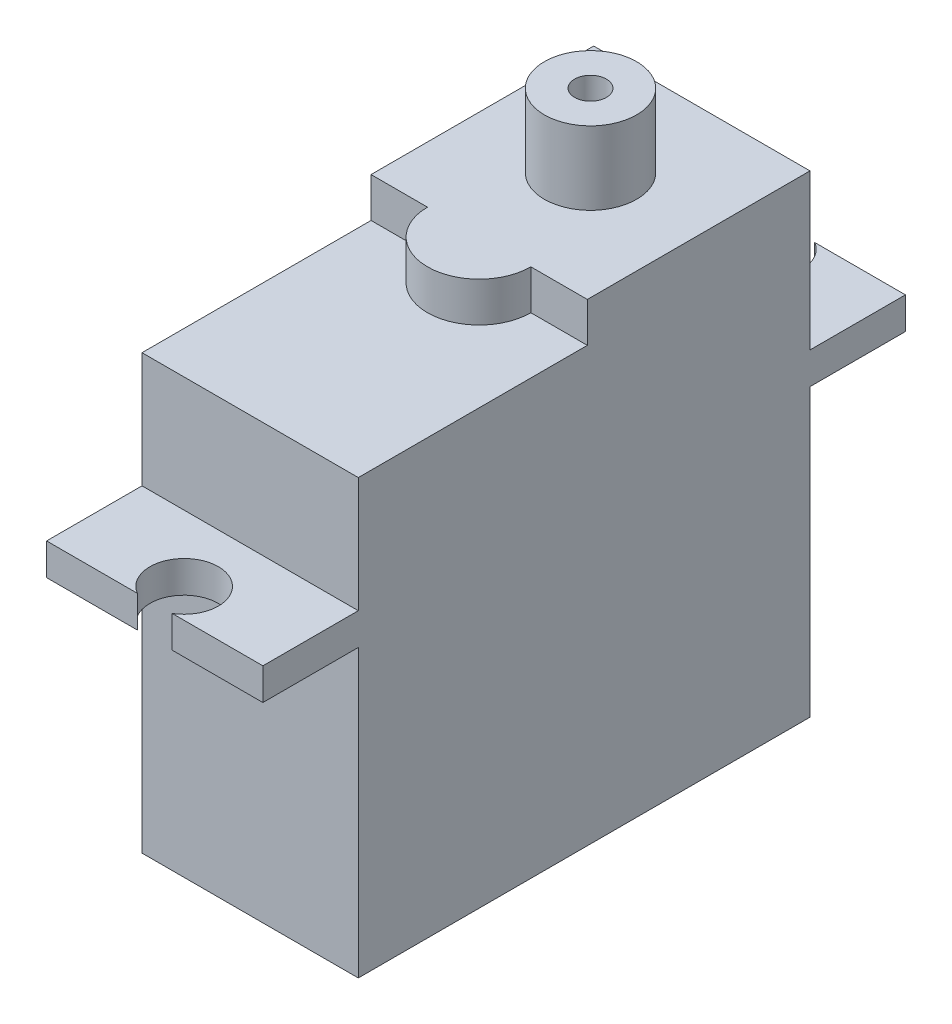
ISO-10303-21;
HEADER;
FILE_DESCRIPTION(('STEP AP214'),'2;1');
FILE_NAME('part.step','',(''),(''),'','','');
FILE_SCHEMA(('AUTOMOTIVE_DESIGN { 1 0 10303 214 1 1 1 1 }'));
ENDSEC;
DATA;
#1=APPLICATION_CONTEXT('core data for automotive mechanical design processes');
#2=APPLICATION_PROTOCOL_DEFINITION('international standard','automotive_design',2000,#1);
#3=PRODUCT_CONTEXT('',#1,'mechanical');
#4=PRODUCT('Part','Part','',(#3));
#5=PRODUCT_RELATED_PRODUCT_CATEGORY('part','',(#4));
#6=PRODUCT_DEFINITION_FORMATION('','',#4);
#7=PRODUCT_DEFINITION_CONTEXT('part definition',#1,'design');
#8=PRODUCT_DEFINITION('design','',#6,#7);
#9=PRODUCT_DEFINITION_SHAPE('','',#8);
#10=(LENGTH_UNIT() NAMED_UNIT(*) SI_UNIT(.MILLI.,.METRE.));
#11=(NAMED_UNIT(*) PLANE_ANGLE_UNIT() SI_UNIT($,.RADIAN.));
#12=(NAMED_UNIT(*) SI_UNIT($,.STERADIAN.) SOLID_ANGLE_UNIT());
#13=UNCERTAINTY_MEASURE_WITH_UNIT(LENGTH_MEASURE(1.E-05),#10,'distance_accuracy_value','');
#14=(GEOMETRIC_REPRESENTATION_CONTEXT(3) GLOBAL_UNCERTAINTY_ASSIGNED_CONTEXT((#13)) GLOBAL_UNIT_ASSIGNED_CONTEXT((#10,
#11,#12)) REPRESENTATION_CONTEXT('',''));
#15=CARTESIAN_POINT('',(0.,0.,0.));
#16=DIRECTION('',(0.,0.,1.));
#17=DIRECTION('',(1.,0.,0.));
#18=AXIS2_PLACEMENT_3D('',#15,#16,#17);
#19=CARTESIAN_POINT('',(-6.79999999999999,18.,-20.2));
#20=DIRECTION('',(0.,0.,1.));
#21=DIRECTION('',(1.,0.,0.));
#22=AXIS2_PLACEMENT_3D('',#19,#20,#21);
#23=PLANE('',#22);
#24=DIRECTION('',(1.,0.,0.));
#25=VECTOR('',#24,1.);
#26=CARTESIAN_POINT('',(-6.79999999999999,18.,-20.2));
#27=LINE('',#26,#25);
#28=CARTESIAN_POINT('',(1.09544511501033,18.,-20.2));
#29=VERTEX_POINT('',#28);
#30=CARTESIAN_POINT('',(6.79999999999999,18.,-20.2));
#31=VERTEX_POINT('',#30);
#32=EDGE_CURVE('E176',#29,#31,#27,.T.);
#33=ORIENTED_EDGE('',*,*,#32,.F.);
#34=DIRECTION('',(0.,1.,0.));
#35=VECTOR('',#34,1.);
#36=CARTESIAN_POINT('',(1.09544511501033,11.9188816817957,-20.2));
#37=LINE('',#36,#35);
#38=CARTESIAN_POINT('',(1.09544511501033,20.,-20.2));
#39=VERTEX_POINT('',#38);
#40=EDGE_CURVE('E11',#29,#39,#37,.T.);
#41=ORIENTED_EDGE('',*,*,#40,.T.);
#42=DIRECTION('',(1.,0.,0.));
#43=VECTOR('',#42,1.);
#44=CARTESIAN_POINT('',(-6.79999999999999,20.,-20.2));
#45=LINE('',#44,#43);
#46=CARTESIAN_POINT('',(6.79999999999999,20.,-20.2));
#47=VERTEX_POINT('',#46);
#48=EDGE_CURVE('E203',#39,#47,#45,.T.);
#49=ORIENTED_EDGE('',*,*,#48,.T.);
#50=DIRECTION('',(0.,1.,0.));
#51=VECTOR('',#50,1.);
#52=CARTESIAN_POINT('',(6.79999999999999,18.,-20.2));
#53=LINE('',#52,#51);
#54=EDGE_CURVE('E183',#31,#47,#53,.T.);
#55=ORIENTED_EDGE('',*,*,#54,.F.);
#56=EDGE_LOOP('',(#33,#41,#49,#55));
#57=FACE_BOUND('',#56,.T.);
#58=ADVANCED_FACE('F33',(#57),#23,.F.);
#59=CARTESIAN_POINT('',(-6.79999999999999,18.,20.2));
#60=DIRECTION('',(0.,0.,-1.));
#61=DIRECTION('',(-1.,0.,0.));
#62=AXIS2_PLACEMENT_3D('',#59,#60,#61);
#63=PLANE('',#62);
#64=DIRECTION('',(-1.,0.,0.));
#65=VECTOR('',#64,1.);
#66=CARTESIAN_POINT('',(-6.79999999999999,18.,20.2));
#67=LINE('',#66,#65);
#68=CARTESIAN_POINT('',(-1.09544511501033,18.,20.2));
#69=VERTEX_POINT('',#68);
#70=CARTESIAN_POINT('',(-6.79999999999999,18.,20.2));
#71=VERTEX_POINT('',#70);
#72=EDGE_CURVE('E354',#69,#71,#67,.T.);
#73=ORIENTED_EDGE('',*,*,#72,.F.);
#74=DIRECTION('',(0.,1.,0.));
#75=VECTOR('',#74,1.);
#76=CARTESIAN_POINT('',(-1.09544511501033,11.9188816817957,20.2));
#77=LINE('',#76,#75);
#78=CARTESIAN_POINT('',(-1.09544511501033,20.,20.2));
#79=VERTEX_POINT('',#78);
#80=EDGE_CURVE('E358',#69,#79,#77,.T.);
#81=ORIENTED_EDGE('',*,*,#80,.T.);
#82=DIRECTION('',(-1.,0.,0.));
#83=VECTOR('',#82,1.);
#84=CARTESIAN_POINT('',(-6.79999999999999,20.,20.2));
#85=LINE('',#84,#83);
#86=CARTESIAN_POINT('',(-6.79999999999999,20.,20.2));
#87=VERTEX_POINT('',#86);
#88=EDGE_CURVE('E194',#79,#87,#85,.T.);
#89=ORIENTED_EDGE('',*,*,#88,.T.);
#90=DIRECTION('',(0.,1.,0.));
#91=VECTOR('',#90,1.);
#92=CARTESIAN_POINT('',(-6.79999999999999,18.,20.2));
#93=LINE('',#92,#91);
#94=EDGE_CURVE('E212',#71,#87,#93,.T.);
#95=ORIENTED_EDGE('',*,*,#94,.F.);
#96=EDGE_LOOP('',(#73,#81,#89,#95));
#97=FACE_BOUND('',#96,.T.);
#98=ADVANCED_FACE('F388',(#97),#63,.F.);
#99=CARTESIAN_POINT('',(-6.79999999999999,27.25,-14.2));
#100=DIRECTION('',(0.,0.,1.));
#101=DIRECTION('',(1.,0.,0.));
#102=AXIS2_PLACEMENT_3D('',#99,#100,#101);
#103=PLANE('',#102);
#104=DIRECTION('',(-1.,0.,0.));
#105=VECTOR('',#104,1.);
#106=CARTESIAN_POINT('',(-6.79999999999999,18.,-14.2));
#107=LINE('',#106,#105);
#108=CARTESIAN_POINT('',(6.79999999999999,18.,-14.2));
#109=VERTEX_POINT('',#108);
#110=CARTESIAN_POINT('',(-6.79999999999999,18.,-14.2));
#111=VERTEX_POINT('',#110);
#112=EDGE_CURVE('E221',#109,#111,#107,.T.);
#113=ORIENTED_EDGE('',*,*,#112,.F.);
#114=DIRECTION('',(0.,-1.,0.));
#115=VECTOR('',#114,1.);
#116=CARTESIAN_POINT('',(6.80000000000001,27.25,-14.2));
#117=LINE('',#116,#115);
#118=CARTESIAN_POINT('',(6.80000000000001,0.,-14.2));
#119=VERTEX_POINT('',#118);
#120=EDGE_CURVE('E295',#109,#119,#117,.T.);
#121=ORIENTED_EDGE('',*,*,#120,.T.);
#122=DIRECTION('',(-1.,0.,0.));
#123=VECTOR('',#122,1.);
#124=CARTESIAN_POINT('',(-6.79999999999999,0.,-14.2));
#125=LINE('',#124,#123);
#126=CARTESIAN_POINT('',(-6.79999999999999,0.,-14.2));
#127=VERTEX_POINT('',#126);
#128=EDGE_CURVE('E313',#119,#127,#125,.T.);
#129=ORIENTED_EDGE('',*,*,#128,.T.);
#130=DIRECTION('',(0.,-1.,0.));
#131=VECTOR('',#130,1.);
#132=CARTESIAN_POINT('',(-6.79999999999999,27.25,-14.2));
#133=LINE('',#132,#131);
#134=EDGE_CURVE('E299',#111,#127,#133,.T.);
#135=ORIENTED_EDGE('',*,*,#134,.F.);
#136=EDGE_LOOP('',(#113,#121,#129,#135));
#137=FACE_BOUND('',#136,.T.);
#138=ADVANCED_FACE('F401',(#137),#103,.F.);
#139=CARTESIAN_POINT('',(-6.79999999999999,27.25,14.2));
#140=DIRECTION('',(0.,0.,-1.));
#141=DIRECTION('',(-1.,0.,0.));
#142=AXIS2_PLACEMENT_3D('',#139,#140,#141);
#143=PLANE('',#142);
#144=DIRECTION('',(1.,0.,0.));
#145=VECTOR('',#144,1.);
#146=CARTESIAN_POINT('',(-6.79999999999999,18.,14.2));
#147=LINE('',#146,#145);
#148=CARTESIAN_POINT('',(-6.79999999999999,18.,14.2));
#149=VERTEX_POINT('',#148);
#150=CARTESIAN_POINT('',(6.79999999999999,18.,14.2));
#151=VERTEX_POINT('',#150);
#152=EDGE_CURVE('E369',#149,#151,#147,.T.);
#153=ORIENTED_EDGE('',*,*,#152,.F.);
#154=DIRECTION('',(0.,-1.,0.));
#155=VECTOR('',#154,1.);
#156=CARTESIAN_POINT('',(-6.79999999999999,27.25,14.2));
#157=LINE('',#156,#155);
#158=CARTESIAN_POINT('',(-6.79999999999999,0.,14.2));
#159=VERTEX_POINT('',#158);
#160=EDGE_CURVE('E303',#149,#159,#157,.T.);
#161=ORIENTED_EDGE('',*,*,#160,.T.);
#162=DIRECTION('',(1.,0.,0.));
#163=VECTOR('',#162,1.);
#164=CARTESIAN_POINT('',(-6.79999999999999,0.,14.2));
#165=LINE('',#164,#163);
#166=CARTESIAN_POINT('',(6.80000000000001,0.,14.2));
#167=VERTEX_POINT('',#166);
#168=EDGE_CURVE('E290',#159,#167,#165,.T.);
#169=ORIENTED_EDGE('',*,*,#168,.T.);
#170=DIRECTION('',(0.,-1.,0.));
#171=VECTOR('',#170,1.);
#172=CARTESIAN_POINT('',(6.80000000000001,27.25,14.2));
#173=LINE('',#172,#171);
#174=EDGE_CURVE('E307',#151,#167,#173,.T.);
#175=ORIENTED_EDGE('',*,*,#174,.F.);
#176=EDGE_LOOP('',(#153,#161,#169,#175));
#177=FACE_BOUND('',#176,.T.);
#178=ADVANCED_FACE('F395',(#177),#143,.F.);
#179=CARTESIAN_POINT('',(0.,29.75,0.));
#180=DIRECTION('',(0.,1.,0.));
#181=DIRECTION('',(0.,0.,1.));
#182=AXIS2_PLACEMENT_3D('',#179,#180,#181);
#183=PLANE('',#182);
#184=DIRECTION('',(-1.,0.,0.));
#185=VECTOR('',#184,1.);
#186=CARTESIAN_POINT('',(0.,29.75,-0.2));
#187=LINE('',#186,#185);
#188=CARTESIAN_POINT('',(-3.24999999999999,29.75,-0.199999999999999));
#189=VERTEX_POINT('',#188);
#190=CARTESIAN_POINT('',(-6.79999999999999,29.75,-0.2));
#191=VERTEX_POINT('',#190);
#192=EDGE_CURVE('E233',#189,#191,#187,.T.);
#193=ORIENTED_EDGE('',*,*,#192,.F.);
#194=CARTESIAN_POINT('',(0.,29.75,-0.2));
#195=DIRECTION('',(0.,1.,0.));
#196=DIRECTION('',(0.,0.,1.));
#197=AXIS2_PLACEMENT_3D('',#194,#195,#196);
#198=CIRCLE('',#197,3.25);
#199=CARTESIAN_POINT('',(3.25000000000001,29.75,-0.2));
#200=VERTEX_POINT('',#199);
#201=EDGE_CURVE('E236',#189,#200,#198,.T.);
#202=ORIENTED_EDGE('',*,*,#201,.T.);
#203=CARTESIAN_POINT('',(6.80000000000001,29.75,-0.200000000000001));
#204=VERTEX_POINT('',#203);
#205=EDGE_CURVE('E238',#204,#200,#187,.T.);
#206=ORIENTED_EDGE('',*,*,#205,.F.);
#207=DIRECTION('',(0.,0.,-1.));
#208=VECTOR('',#207,1.);
#209=CARTESIAN_POINT('',(6.80000000000001,29.75,0.));
#210=LINE('',#209,#208);
#211=CARTESIAN_POINT('',(6.80000000000001,29.75,-14.2));
#212=VERTEX_POINT('',#211);
#213=EDGE_CURVE('E240',#204,#212,#210,.T.);
#214=ORIENTED_EDGE('',*,*,#213,.T.);
#215=DIRECTION('',(-1.,0.,0.));
#216=VECTOR('',#215,1.);
#217=CARTESIAN_POINT('',(0.,29.75,-14.2));
#218=LINE('',#217,#216);
#219=CARTESIAN_POINT('',(-6.79999999999999,29.75,-14.2));
#220=VERTEX_POINT('',#219);
#221=EDGE_CURVE('E243',#212,#220,#218,.T.);
#222=ORIENTED_EDGE('',*,*,#221,.T.);
#223=DIRECTION('',(0.,0.,1.));
#224=VECTOR('',#223,1.);
#225=CARTESIAN_POINT('',(-6.79999999999999,29.75,0.));
#226=LINE('',#225,#224);
#227=EDGE_CURVE('E246',#220,#191,#226,.T.);
#228=ORIENTED_EDGE('',*,*,#227,.T.);
#229=EDGE_LOOP('',(#193,#202,#206,#214,#222,#228));
#230=FACE_BOUND('',#229,.T.);
#231=CARTESIAN_POINT('',(0.,29.75,-7.2));
#232=DIRECTION('',(0.,1.,0.));
#233=DIRECTION('',(0.,0.,1.));
#234=AXIS2_PLACEMENT_3D('',#231,#232,#233);
#235=CIRCLE('',#234,2.9);
#236=CARTESIAN_POINT('',(0.,29.75,-4.3));
#237=VERTEX_POINT('',#236);
#238=EDGE_CURVE('E226',#237,#237,#235,.T.);
#239=ORIENTED_EDGE('',*,*,#238,.F.);
#240=EDGE_LOOP('',(#239));
#241=FACE_BOUND('',#240,.T.);
#242=ADVANCED_FACE('F341',(#230,#241),#183,.T.);
#243=CARTESIAN_POINT('',(6.80000000000001,27.25,14.2));
#244=DIRECTION('',(-1.,0.,0.));
#245=DIRECTION('',(0.,0.,1.));
#246=AXIS2_PLACEMENT_3D('',#243,#244,#245);
#247=PLANE('',#246);
#248=CARTESIAN_POINT('',(6.80000000000001,27.25,14.2));
#249=VERTEX_POINT('',#248);
#250=CARTESIAN_POINT('',(6.80000000000001,20.,14.2));
#251=VERTEX_POINT('',#250);
#252=EDGE_CURVE('E304',#249,#251,#173,.T.);
#253=ORIENTED_EDGE('',*,*,#252,.T.);
#254=DIRECTION('',(0.,0.,1.));
#255=VECTOR('',#254,1.);
#256=CARTESIAN_POINT('',(6.79999999999999,20.,-20.2));
#257=LINE('',#256,#255);
#258=CARTESIAN_POINT('',(6.79999999999999,20.,20.2));
#259=VERTEX_POINT('',#258);
#260=EDGE_CURVE('E195',#251,#259,#257,.T.);
#261=ORIENTED_EDGE('',*,*,#260,.T.);
#262=DIRECTION('',(0.,1.,0.));
#263=VECTOR('',#262,1.);
#264=CARTESIAN_POINT('',(6.79999999999999,18.,20.2));
#265=LINE('',#264,#263);
#266=CARTESIAN_POINT('',(6.79999999999999,18.,20.2));
#267=VERTEX_POINT('',#266);
#268=EDGE_CURVE('E215',#267,#259,#265,.T.);
#269=ORIENTED_EDGE('',*,*,#268,.F.);
#270=DIRECTION('',(0.,0.,1.));
#271=VECTOR('',#270,1.);
#272=CARTESIAN_POINT('',(6.79999999999999,18.,-20.2));
#273=LINE('',#272,#271);
#274=EDGE_CURVE('E207',#151,#267,#273,.T.);
#275=ORIENTED_EDGE('',*,*,#274,.F.);
#276=ORIENTED_EDGE('',*,*,#174,.T.);
#277=DIRECTION('',(0.,0.,-1.));
#278=VECTOR('',#277,1.);
#279=CARTESIAN_POINT('',(6.80000000000001,0.,14.2));
#280=LINE('',#279,#278);
#281=EDGE_CURVE('E282',#167,#119,#280,.T.);
#282=ORIENTED_EDGE('',*,*,#281,.T.);
#283=ORIENTED_EDGE('',*,*,#120,.F.);
#284=EDGE_CURVE('E352',#31,#109,#273,.T.);
#285=ORIENTED_EDGE('',*,*,#284,.F.);
#286=ORIENTED_EDGE('',*,*,#54,.T.);
#287=CARTESIAN_POINT('',(6.79999999999999,20.,-14.2));
#288=VERTEX_POINT('',#287);
#289=EDGE_CURVE('E191',#47,#288,#257,.T.);
#290=ORIENTED_EDGE('',*,*,#289,.T.);
#291=EDGE_CURVE('E291',#212,#288,#117,.T.);
#292=ORIENTED_EDGE('',*,*,#291,.F.);
#293=ORIENTED_EDGE('',*,*,#213,.F.);
#294=DIRECTION('',(0.,-1.,0.));
#295=VECTOR('',#294,1.);
#296=CARTESIAN_POINT('',(6.80000000000001,29.75,-0.200000000000001));
#297=LINE('',#296,#295);
#298=CARTESIAN_POINT('',(6.80000000000001,27.25,-0.199999999999994));
#299=VERTEX_POINT('',#298);
#300=EDGE_CURVE('E265',#204,#299,#297,.T.);
#301=ORIENTED_EDGE('',*,*,#300,.T.);
#302=DIRECTION('',(0.,0.,-1.));
#303=VECTOR('',#302,1.);
#304=CARTESIAN_POINT('',(6.80000000000001,27.25,14.2));
#305=LINE('',#304,#303);
#306=EDGE_CURVE('E288',#249,#299,#305,.T.);
#307=ORIENTED_EDGE('',*,*,#306,.F.);
#308=EDGE_LOOP('',(#253,#261,#269,#275,#276,#282,#283,#285,#286,#290,#292,#293,#301,#307));
#309=FACE_BOUND('',#308,.T.);
#310=ADVANCED_FACE('F35',(#309),#247,.F.);
#311=ORIENTED_EDGE('',*,*,#291,.T.);
#312=DIRECTION('',(-1.,0.,0.));
#313=VECTOR('',#312,1.);
#314=CARTESIAN_POINT('',(-6.79999999999999,20.,-14.2));
#315=LINE('',#314,#313);
#316=CARTESIAN_POINT('',(-6.79999999999999,20.,-14.2));
#317=VERTEX_POINT('',#316);
#318=EDGE_CURVE('E218',#288,#317,#315,.T.);
#319=ORIENTED_EDGE('',*,*,#318,.T.);
#320=EDGE_CURVE('E296',#220,#317,#133,.T.);
#321=ORIENTED_EDGE('',*,*,#320,.F.);
#322=ORIENTED_EDGE('',*,*,#221,.F.);
#323=EDGE_LOOP('',(#311,#319,#321,#322));
#324=FACE_BOUND('',#323,.T.);
#325=ADVANCED_FACE('F346',(#324),#103,.F.);
#326=CARTESIAN_POINT('',(-6.79999999999999,27.25,14.2));
#327=DIRECTION('',(1.,0.,0.));
#328=DIRECTION('',(0.,0.,-1.));
#329=AXIS2_PLACEMENT_3D('',#326,#327,#328);
#330=PLANE('',#329);
#331=ORIENTED_EDGE('',*,*,#320,.T.);
#332=DIRECTION('',(0.,0.,-1.));
#333=VECTOR('',#332,1.);
#334=CARTESIAN_POINT('',(-6.79999999999999,20.,-20.2));
#335=LINE('',#334,#333);
#336=CARTESIAN_POINT('',(-6.79999999999999,20.,-20.2));
#337=VERTEX_POINT('',#336);
#338=EDGE_CURVE('E199',#317,#337,#335,.T.);
#339=ORIENTED_EDGE('',*,*,#338,.T.);
#340=DIRECTION('',(0.,1.,0.));
#341=VECTOR('',#340,1.);
#342=CARTESIAN_POINT('',(-6.79999999999999,18.,-20.2));
#343=LINE('',#342,#341);
#344=CARTESIAN_POINT('',(-6.79999999999999,18.,-20.2));
#345=VERTEX_POINT('',#344);
#346=EDGE_CURVE('E209',#345,#337,#343,.T.);
#347=ORIENTED_EDGE('',*,*,#346,.F.);
#348=DIRECTION('',(0.,0.,-1.));
#349=VECTOR('',#348,1.);
#350=CARTESIAN_POINT('',(-6.79999999999999,18.,-20.2));
#351=LINE('',#350,#349);
#352=EDGE_CURVE('E187',#111,#345,#351,.T.);
#353=ORIENTED_EDGE('',*,*,#352,.F.);
#354=ORIENTED_EDGE('',*,*,#134,.T.);
#355=DIRECTION('',(0.,0.,1.));
#356=VECTOR('',#355,1.);
#357=CARTESIAN_POINT('',(-6.79999999999999,0.,14.2));
#358=LINE('',#357,#356);
#359=EDGE_CURVE('E310',#127,#159,#358,.T.);
#360=ORIENTED_EDGE('',*,*,#359,.T.);
#361=ORIENTED_EDGE('',*,*,#160,.F.);
#362=EDGE_CURVE('E185',#71,#149,#351,.T.);
#363=ORIENTED_EDGE('',*,*,#362,.F.);
#364=ORIENTED_EDGE('',*,*,#94,.T.);
#365=CARTESIAN_POINT('',(-6.79999999999999,20.,14.2));
#366=VERTEX_POINT('',#365);
#367=EDGE_CURVE('E200',#87,#366,#335,.T.);
#368=ORIENTED_EDGE('',*,*,#367,.T.);
#369=CARTESIAN_POINT('',(-6.79999999999999,27.25,14.2));
#370=VERTEX_POINT('',#369);
#371=EDGE_CURVE('E300',#370,#366,#157,.T.);
#372=ORIENTED_EDGE('',*,*,#371,.F.);
#373=DIRECTION('',(0.,0.,1.));
#374=VECTOR('',#373,1.);
#375=CARTESIAN_POINT('',(-6.79999999999999,27.25,14.2));
#376=LINE('',#375,#374);
#377=CARTESIAN_POINT('',(-6.79999999999999,27.25,-0.199999999999992));
#378=VERTEX_POINT('',#377);
#379=EDGE_CURVE('E260',#378,#370,#376,.T.);
#380=ORIENTED_EDGE('',*,*,#379,.F.);
#381=DIRECTION('',(0.,-1.,0.));
#382=VECTOR('',#381,1.);
#383=CARTESIAN_POINT('',(-6.79999999999999,29.75,-0.2));
#384=LINE('',#383,#382);
#385=EDGE_CURVE('E248',#191,#378,#384,.T.);
#386=ORIENTED_EDGE('',*,*,#385,.F.);
#387=ORIENTED_EDGE('',*,*,#227,.F.);
#388=EDGE_LOOP('',(#331,#339,#347,#353,#354,#360,#361,#363,#364,#368,#372,#380,#386,#387));
#389=FACE_BOUND('',#388,.T.);
#390=ADVANCED_FACE('F327',(#389),#330,.F.);
#391=ORIENTED_EDGE('',*,*,#371,.T.);
#392=DIRECTION('',(1.,0.,0.));
#393=VECTOR('',#392,1.);
#394=CARTESIAN_POINT('',(-6.79999999999999,20.,14.2));
#395=LINE('',#394,#393);
#396=EDGE_CURVE('E332',#366,#251,#395,.T.);
#397=ORIENTED_EDGE('',*,*,#396,.T.);
#398=ORIENTED_EDGE('',*,*,#252,.F.);
#399=DIRECTION('',(1.,0.,0.));
#400=VECTOR('',#399,1.);
#401=CARTESIAN_POINT('',(-6.79999999999999,27.25,14.2));
#402=LINE('',#401,#400);
#403=EDGE_CURVE('E317',#370,#249,#402,.T.);
#404=ORIENTED_EDGE('',*,*,#403,.F.);
#405=EDGE_LOOP('',(#391,#397,#398,#404));
#406=FACE_BOUND('',#405,.T.);
#407=ADVANCED_FACE('F331',(#406),#143,.F.);
#408=CARTESIAN_POINT('',(0.,27.25,0.));
#409=DIRECTION('',(0.,-1.,0.));
#410=DIRECTION('',(0.,0.,-1.));
#411=AXIS2_PLACEMENT_3D('',#408,#409,#410);
#412=PLANE('',#411);
#413=CARTESIAN_POINT('',(0.,27.25,-0.2));
#414=DIRECTION('',(0.,1.,0.));
#415=DIRECTION('',(0.,0.,1.));
#416=AXIS2_PLACEMENT_3D('',#413,#414,#415);
#417=CIRCLE('',#416,3.25);
#418=CARTESIAN_POINT('',(-3.24999999999999,27.25,-0.199999999999999));
#419=VERTEX_POINT('',#418);
#420=CARTESIAN_POINT('',(3.25000000000001,27.25,-0.2));
#421=VERTEX_POINT('',#420);
#422=EDGE_CURVE('E251',#419,#421,#417,.T.);
#423=ORIENTED_EDGE('',*,*,#422,.F.);
#424=DIRECTION('',(-1.,0.,0.));
#425=VECTOR('',#424,1.);
#426=CARTESIAN_POINT('',(0.,27.25,-0.2));
#427=LINE('',#426,#425);
#428=EDGE_CURVE('E230',#419,#378,#427,.T.);
#429=ORIENTED_EDGE('',*,*,#428,.T.);
#430=ORIENTED_EDGE('',*,*,#379,.T.);
#431=ORIENTED_EDGE('',*,*,#403,.T.);
#432=ORIENTED_EDGE('',*,*,#306,.T.);
#433=EDGE_CURVE('E237',#299,#421,#427,.T.);
#434=ORIENTED_EDGE('',*,*,#433,.T.);
#435=EDGE_LOOP('',(#423,#429,#430,#431,#432,#434));
#436=FACE_BOUND('',#435,.T.);
#437=ADVANCED_FACE('F323',(#436),#412,.F.);
#438=CARTESIAN_POINT('',(0.,0.,0.));
#439=DIRECTION('',(0.,-1.,0.));
#440=DIRECTION('',(0.,0.,-1.));
#441=AXIS2_PLACEMENT_3D('',#438,#439,#440);
#442=PLANE('',#441);
#443=ORIENTED_EDGE('',*,*,#281,.F.);
#444=ORIENTED_EDGE('',*,*,#168,.F.);
#445=ORIENTED_EDGE('',*,*,#359,.F.);
#446=ORIENTED_EDGE('',*,*,#128,.F.);
#447=EDGE_LOOP('',(#443,#444,#445,#446));
#448=FACE_BOUND('',#447,.T.);
#449=ADVANCED_FACE('F441',(#448),#442,.T.);
#450=CARTESIAN_POINT('',(0.,29.75,-0.2));
#451=DIRECTION('',(0.,0.,1.));
#452=DIRECTION('',(1.,0.,0.));
#453=AXIS2_PLACEMENT_3D('',#450,#451,#452);
#454=PLANE('',#453);
#455=ORIENTED_EDGE('',*,*,#428,.F.);
#456=DIRECTION('',(0.,-1.,0.));
#457=VECTOR('',#456,1.);
#458=CARTESIAN_POINT('',(-3.24999999999999,29.75,-0.199999999999999));
#459=LINE('',#458,#457);
#460=EDGE_CURVE('E276',#189,#419,#459,.T.);
#461=ORIENTED_EDGE('',*,*,#460,.F.);
#462=ORIENTED_EDGE('',*,*,#192,.T.);
#463=ORIENTED_EDGE('',*,*,#385,.T.);
#464=EDGE_LOOP('',(#455,#461,#462,#463));
#465=FACE_BOUND('',#464,.T.);
#466=ADVANCED_FACE('F338',(#465),#454,.T.);
#467=CARTESIAN_POINT('',(0.,29.75,-0.2));
#468=DIRECTION('',(0.,-1.,0.));
#469=DIRECTION('',(0.,0.,-1.));
#470=AXIS2_PLACEMENT_3D('',#467,#468,#469);
#471=CYLINDRICAL_SURFACE('',#470,3.25);
#472=ORIENTED_EDGE('',*,*,#422,.T.);
#473=DIRECTION('',(0.,-1.,0.));
#474=VECTOR('',#473,1.);
#475=CARTESIAN_POINT('',(3.25000000000001,29.75,-0.2));
#476=LINE('',#475,#474);
#477=EDGE_CURVE('E269',#200,#421,#476,.T.);
#478=ORIENTED_EDGE('',*,*,#477,.F.);
#479=ORIENTED_EDGE('',*,*,#201,.F.);
#480=ORIENTED_EDGE('',*,*,#460,.T.);
#481=EDGE_LOOP('',(#472,#478,#479,#480));
#482=FACE_BOUND('',#481,.T.);
#483=ADVANCED_FACE('F334',(#482),#471,.T.);
#484=ORIENTED_EDGE('',*,*,#433,.F.);
#485=ORIENTED_EDGE('',*,*,#300,.F.);
#486=ORIENTED_EDGE('',*,*,#205,.T.);
#487=ORIENTED_EDGE('',*,*,#477,.T.);
#488=EDGE_LOOP('',(#484,#485,#486,#487));
#489=FACE_BOUND('',#488,.T.);
#490=ADVANCED_FACE('F501',(#489),#454,.T.);
#491=CARTESIAN_POINT('',(0.,34.35,-7.2));
#492=DIRECTION('',(0.,1.,0.));
#493=DIRECTION('',(0.,0.,1.));
#494=AXIS2_PLACEMENT_3D('',#491,#492,#493);
#495=PLANE('',#494);
#496=CARTESIAN_POINT('',(0.,34.35,-7.2));
#497=DIRECTION('',(0.,1.,0.));
#498=DIRECTION('',(0.,0.,1.));
#499=AXIS2_PLACEMENT_3D('',#496,#497,#498);
#500=CIRCLE('',#499,2.9);
#501=CARTESIAN_POINT('',(0.,34.35,-4.3));
#502=VERTEX_POINT('',#501);
#503=EDGE_CURVE('E227',#502,#502,#500,.T.);
#504=ORIENTED_EDGE('',*,*,#503,.T.);
#505=EDGE_LOOP('',(#504));
#506=FACE_BOUND('',#505,.T.);
#507=CARTESIAN_POINT('',(0.,34.35,-7.2));
#508=DIRECTION('',(0.,1.,0.));
#509=DIRECTION('',(0.,0.,1.));
#510=AXIS2_PLACEMENT_3D('',#507,#508,#509);
#511=CIRCLE('',#510,1.);
#512=CARTESIAN_POINT('',(0.,34.35,-6.2));
#513=VERTEX_POINT('',#512);
#514=EDGE_CURVE('E223',#513,#513,#511,.T.);
#515=ORIENTED_EDGE('',*,*,#514,.F.);
#516=EDGE_LOOP('',(#515));
#517=FACE_BOUND('',#516,.T.);
#518=ADVANCED_FACE('F493',(#506,#517),#495,.T.);
#519=CARTESIAN_POINT('',(0.,34.35,-7.2));
#520=DIRECTION('',(0.,-1.,0.));
#521=DIRECTION('',(0.,0.,-1.));
#522=AXIS2_PLACEMENT_3D('',#519,#520,#521);
#523=CYLINDRICAL_SURFACE('',#522,2.9);
#524=ORIENTED_EDGE('',*,*,#503,.F.);
#525=EDGE_LOOP('',(#524));
#526=FACE_BOUND('',#525,.T.);
#527=ORIENTED_EDGE('',*,*,#238,.T.);
#528=EDGE_LOOP('',(#527));
#529=FACE_BOUND('',#528,.T.);
#530=ADVANCED_FACE('F389',(#526,#529),#523,.T.);
#531=CARTESIAN_POINT('',(0.,34.35,-7.2));
#532=DIRECTION('',(0.,-1.,0.));
#533=DIRECTION('',(0.,0.,-1.));
#534=AXIS2_PLACEMENT_3D('',#531,#532,#533);
#535=CYLINDRICAL_SURFACE('',#534,1.);
#536=ORIENTED_EDGE('',*,*,#514,.T.);
#537=EDGE_LOOP('',(#536));
#538=FACE_BOUND('',#537,.T.);
#539=CARTESIAN_POINT('',(0.,29.75,-7.2));
#540=DIRECTION('',(0.,1.,0.));
#541=DIRECTION('',(0.,0.,1.));
#542=AXIS2_PLACEMENT_3D('',#539,#540,#541);
#543=CIRCLE('',#542,1.);
#544=CARTESIAN_POINT('',(0.,29.75,-6.2));
#545=VERTEX_POINT('',#544);
#546=EDGE_CURVE('E294',#545,#545,#543,.F.);
#547=ORIENTED_EDGE('',*,*,#546,.T.);
#548=EDGE_LOOP('',(#547));
#549=FACE_BOUND('',#548,.T.);
#550=ADVANCED_FACE('F375',(#538,#549),#535,.F.);
#551=ORIENTED_EDGE('',*,*,#546,.F.);
#552=EDGE_LOOP('',(#551));
#553=FACE_BOUND('',#552,.T.);
#554=ADVANCED_FACE('F377',(#553),#183,.T.);
#555=CARTESIAN_POINT('',(1.09544511501033,20.,20.2));
#556=VERTEX_POINT('',#555);
#557=EDGE_CURVE('E196',#259,#556,#85,.T.);
#558=ORIENTED_EDGE('',*,*,#557,.T.);
#559=DIRECTION('',(0.,1.,0.));
#560=VECTOR('',#559,1.);
#561=CARTESIAN_POINT('',(1.09544511501033,11.9188816817957,20.2));
#562=LINE('',#561,#560);
#563=CARTESIAN_POINT('',(1.09544511501033,18.,20.2));
#564=VERTEX_POINT('',#563);
#565=EDGE_CURVE('E56',#556,#564,#562,.F.);
#566=ORIENTED_EDGE('',*,*,#565,.T.);
#567=EDGE_CURVE('E356',#267,#564,#67,.T.);
#568=ORIENTED_EDGE('',*,*,#567,.F.);
#569=ORIENTED_EDGE('',*,*,#268,.T.);
#570=EDGE_LOOP('',(#558,#566,#568,#569));
#571=FACE_BOUND('',#570,.T.);
#572=ADVANCED_FACE('F379',(#571),#63,.F.);
#573=CARTESIAN_POINT('',(0.,18.,0.));
#574=DIRECTION('',(0.,1.,0.));
#575=DIRECTION('',(0.,0.,1.));
#576=AXIS2_PLACEMENT_3D('',#573,#574,#575);
#577=PLANE('',#576);
#578=ORIENTED_EDGE('',*,*,#567,.T.);
#579=CARTESIAN_POINT('',(0.,18.,18.35));
#580=DIRECTION('',(0.,1.,0.));
#581=DIRECTION('',(0.,0.,1.));
#582=AXIS2_PLACEMENT_3D('',#579,#580,#581);
#583=CIRCLE('',#582,2.15);
#584=EDGE_CURVE('E424',#69,#564,#583,.F.);
#585=ORIENTED_EDGE('',*,*,#584,.F.);
#586=ORIENTED_EDGE('',*,*,#72,.T.);
#587=ORIENTED_EDGE('',*,*,#362,.T.);
#588=ORIENTED_EDGE('',*,*,#152,.T.);
#589=ORIENTED_EDGE('',*,*,#274,.T.);
#590=EDGE_LOOP('',(#578,#585,#586,#587,#588,#589));
#591=FACE_BOUND('',#590,.T.);
#592=ADVANCED_FACE('F385',(#591),#577,.F.);
#593=CARTESIAN_POINT('',(0.,20.,0.));
#594=DIRECTION('',(0.,1.,0.));
#595=DIRECTION('',(0.,0.,1.));
#596=AXIS2_PLACEMENT_3D('',#593,#594,#595);
#597=PLANE('',#596);
#598=CARTESIAN_POINT('',(0.,20.,18.35));
#599=DIRECTION('',(0.,1.,0.));
#600=DIRECTION('',(0.,0.,1.));
#601=AXIS2_PLACEMENT_3D('',#598,#599,#600);
#602=CIRCLE('',#601,2.15);
#603=EDGE_CURVE('E180',#556,#79,#602,.T.);
#604=ORIENTED_EDGE('',*,*,#603,.F.);
#605=ORIENTED_EDGE('',*,*,#557,.F.);
#606=ORIENTED_EDGE('',*,*,#260,.F.);
#607=ORIENTED_EDGE('',*,*,#396,.F.);
#608=ORIENTED_EDGE('',*,*,#367,.F.);
#609=ORIENTED_EDGE('',*,*,#88,.F.);
#610=EDGE_LOOP('',(#604,#605,#606,#607,#608,#609));
#611=FACE_BOUND('',#610,.T.);
#612=ADVANCED_FACE('F411',(#611),#597,.T.);
#613=CARTESIAN_POINT('',(-1.09544511501033,18.,-20.2));
#614=VERTEX_POINT('',#613);
#615=EDGE_CURVE('E179',#345,#614,#27,.T.);
#616=ORIENTED_EDGE('',*,*,#615,.T.);
#617=CARTESIAN_POINT('',(0.,18.,-18.35));
#618=DIRECTION('',(0.,1.,0.));
#619=DIRECTION('',(0.,0.,1.));
#620=AXIS2_PLACEMENT_3D('',#617,#618,#619);
#621=CIRCLE('',#620,2.15);
#622=EDGE_CURVE('E48',#29,#614,#621,.F.);
#623=ORIENTED_EDGE('',*,*,#622,.F.);
#624=ORIENTED_EDGE('',*,*,#32,.T.);
#625=ORIENTED_EDGE('',*,*,#284,.T.);
#626=ORIENTED_EDGE('',*,*,#112,.T.);
#627=ORIENTED_EDGE('',*,*,#352,.T.);
#628=EDGE_LOOP('',(#616,#623,#624,#625,#626,#627));
#629=FACE_BOUND('',#628,.T.);
#630=ADVANCED_FACE('F175',(#629),#577,.F.);
#631=CARTESIAN_POINT('',(0.,20.,-18.35));
#632=DIRECTION('',(0.,1.,0.));
#633=DIRECTION('',(0.,0.,1.));
#634=AXIS2_PLACEMENT_3D('',#631,#632,#633);
#635=CIRCLE('',#634,2.15);
#636=CARTESIAN_POINT('',(-1.09544511501033,20.,-20.2));
#637=VERTEX_POINT('',#636);
#638=EDGE_CURVE('E169',#637,#39,#635,.T.);
#639=ORIENTED_EDGE('',*,*,#638,.F.);
#640=EDGE_CURVE('E204',#337,#637,#45,.T.);
#641=ORIENTED_EDGE('',*,*,#640,.F.);
#642=ORIENTED_EDGE('',*,*,#338,.F.);
#643=ORIENTED_EDGE('',*,*,#318,.F.);
#644=ORIENTED_EDGE('',*,*,#289,.F.);
#645=ORIENTED_EDGE('',*,*,#48,.F.);
#646=EDGE_LOOP('',(#639,#641,#642,#643,#644,#645));
#647=FACE_BOUND('',#646,.T.);
#648=ADVANCED_FACE('F349',(#647),#597,.T.);
#649=ORIENTED_EDGE('',*,*,#640,.T.);
#650=DIRECTION('',(0.,1.,0.));
#651=VECTOR('',#650,1.);
#652=CARTESIAN_POINT('',(-1.09544511501033,11.9188816817957,-20.2));
#653=LINE('',#652,#651);
#654=EDGE_CURVE('E41',#637,#614,#653,.F.);
#655=ORIENTED_EDGE('',*,*,#654,.T.);
#656=ORIENTED_EDGE('',*,*,#615,.F.);
#657=ORIENTED_EDGE('',*,*,#346,.T.);
#658=EDGE_LOOP('',(#649,#655,#656,#657));
#659=FACE_BOUND('',#658,.T.);
#660=ADVANCED_FACE('F368',(#659),#23,.F.);
#661=CARTESIAN_POINT('',(0.,11.9188816817957,18.35));
#662=DIRECTION('',(0.,1.,0.));
#663=DIRECTION('',(0.,0.,1.));
#664=AXIS2_PLACEMENT_3D('',#661,#662,#663);
#665=CYLINDRICAL_SURFACE('',#664,2.15);
#666=ORIENTED_EDGE('',*,*,#584,.T.);
#667=ORIENTED_EDGE('',*,*,#565,.F.);
#668=ORIENTED_EDGE('',*,*,#603,.T.);
#669=ORIENTED_EDGE('',*,*,#80,.F.);
#670=EDGE_LOOP('',(#666,#667,#668,#669));
#671=FACE_BOUND('',#670,.T.);
#672=ADVANCED_FACE('F405',(#671),#665,.F.);
#673=CARTESIAN_POINT('',(0.,11.9188816817957,-18.35));
#674=DIRECTION('',(0.,1.,0.));
#675=DIRECTION('',(0.,0.,1.));
#676=AXIS2_PLACEMENT_3D('',#673,#674,#675);
#677=CYLINDRICAL_SURFACE('',#676,2.15);
#678=ORIENTED_EDGE('',*,*,#622,.T.);
#679=ORIENTED_EDGE('',*,*,#654,.F.);
#680=ORIENTED_EDGE('',*,*,#638,.T.);
#681=ORIENTED_EDGE('',*,*,#40,.F.);
#682=EDGE_LOOP('',(#678,#679,#680,#681));
#683=FACE_BOUND('',#682,.T.);
#684=ADVANCED_FACE('F167',(#683),#677,.F.);
#685=CLOSED_SHELL('',(#58,#98,#138,#178,#242,#310,#325,#390,#407,#437,#449,#466,#483,#490,#518,
#530,#550,#554,#572,#592,#612,#630,#648,#660,#672,#684));
#686=MANIFOLD_SOLID_BREP('B2',#685);
#687=ADVANCED_BREP_SHAPE_REPRESENTATION('',(#18,#686),#14);
#688=SHAPE_DEFINITION_REPRESENTATION(#9,#687);
ENDSEC;
END-ISO-10303-21;
